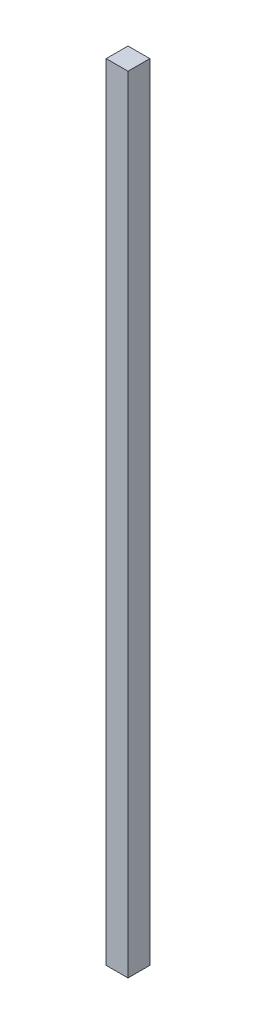
ISO-10303-21;
HEADER;
FILE_DESCRIPTION(('STEP AP214'),'2;1');
FILE_NAME('part.step','',(''),(''),'','','');
FILE_SCHEMA(('AUTOMOTIVE_DESIGN { 1 0 10303 214 1 1 1 1 }'));
ENDSEC;
DATA;
#1=APPLICATION_CONTEXT('core data for automotive mechanical design processes');
#2=APPLICATION_PROTOCOL_DEFINITION('international standard','automotive_design',2000,#1);
#3=PRODUCT_CONTEXT('',#1,'mechanical');
#4=PRODUCT('Part','Part','',(#3));
#5=PRODUCT_RELATED_PRODUCT_CATEGORY('part','',(#4));
#6=PRODUCT_DEFINITION_FORMATION('','',#4);
#7=PRODUCT_DEFINITION_CONTEXT('part definition',#1,'design');
#8=PRODUCT_DEFINITION('design','',#6,#7);
#9=PRODUCT_DEFINITION_SHAPE('','',#8);
#10=(LENGTH_UNIT() NAMED_UNIT(*) SI_UNIT(.MILLI.,.METRE.));
#11=(NAMED_UNIT(*) PLANE_ANGLE_UNIT() SI_UNIT($,.RADIAN.));
#12=(NAMED_UNIT(*) SI_UNIT($,.STERADIAN.) SOLID_ANGLE_UNIT());
#13=UNCERTAINTY_MEASURE_WITH_UNIT(LENGTH_MEASURE(1.E-05),#10,'distance_accuracy_value','');
#14=(GEOMETRIC_REPRESENTATION_CONTEXT(3) GLOBAL_UNCERTAINTY_ASSIGNED_CONTEXT((#13)) GLOBAL_UNIT_ASSIGNED_CONTEXT((#10,
#11,#12)) REPRESENTATION_CONTEXT('',''));
#15=CARTESIAN_POINT('',(0.,0.,0.));
#16=DIRECTION('',(0.,0.,1.));
#17=DIRECTION('',(1.,0.,0.));
#18=AXIS2_PLACEMENT_3D('',#15,#16,#17);
#19=CARTESIAN_POINT('',(25.4,-457.199999999999,12.7));
#20=DIRECTION('',(0.,0.,-1.));
#21=DIRECTION('',(-1.,0.,0.));
#22=AXIS2_PLACEMENT_3D('',#19,#20,#21);
#23=PLANE('',#22);
#24=DIRECTION('',(0.,-1.,0.));
#25=VECTOR('',#24,1.);
#26=CARTESIAN_POINT('',(0.,-457.199999999999,12.7));
#27=LINE('',#26,#25);
#28=CARTESIAN_POINT('',(0.,457.200000000001,12.7));
#29=VERTEX_POINT('',#28);
#30=CARTESIAN_POINT('',(0.,-457.199999999999,12.7));
#31=VERTEX_POINT('',#30);
#32=EDGE_CURVE('E96',#29,#31,#27,.T.);
#33=ORIENTED_EDGE('',*,*,#32,.T.);
#34=DIRECTION('',(-1.,0.,0.));
#35=VECTOR('',#34,1.);
#36=CARTESIAN_POINT('',(25.4,-457.199999999999,12.7));
#37=LINE('',#36,#35);
#38=CARTESIAN_POINT('',(25.4,-457.199999999999,12.7));
#39=VERTEX_POINT('',#38);
#40=EDGE_CURVE('E11',#39,#31,#37,.T.);
#41=ORIENTED_EDGE('',*,*,#40,.F.);
#42=DIRECTION('',(0.,-1.,0.));
#43=VECTOR('',#42,1.);
#44=CARTESIAN_POINT('',(25.4,-457.199999999999,12.7));
#45=LINE('',#44,#43);
#46=CARTESIAN_POINT('',(25.4,457.200000000001,12.7));
#47=VERTEX_POINT('',#46);
#48=EDGE_CURVE('E84',#47,#39,#45,.T.);
#49=ORIENTED_EDGE('',*,*,#48,.F.);
#50=DIRECTION('',(-1.,0.,0.));
#51=VECTOR('',#50,1.);
#52=CARTESIAN_POINT('',(25.4,457.200000000001,12.7));
#53=LINE('',#52,#51);
#54=EDGE_CURVE('E92',#47,#29,#53,.T.);
#55=ORIENTED_EDGE('',*,*,#54,.T.);
#56=EDGE_LOOP('',(#33,#41,#49,#55));
#57=FACE_BOUND('',#56,.T.);
#58=ADVANCED_FACE('F33',(#57),#23,.F.);
#59=CARTESIAN_POINT('',(25.4,-457.199999999999,-12.7));
#60=DIRECTION('',(0.,1.,0.));
#61=DIRECTION('',(0.,0.,1.));
#62=AXIS2_PLACEMENT_3D('',#59,#60,#61);
#63=PLANE('',#62);
#64=DIRECTION('',(0.,0.,-1.));
#65=VECTOR('',#64,1.);
#66=CARTESIAN_POINT('',(0.,-457.199999999999,-12.7));
#67=LINE('',#66,#65);
#68=CARTESIAN_POINT('',(0.,-457.199999999999,-12.7));
#69=VERTEX_POINT('',#68);
#70=EDGE_CURVE('E88',#31,#69,#67,.T.);
#71=ORIENTED_EDGE('',*,*,#70,.T.);
#72=DIRECTION('',(-1.,0.,0.));
#73=VECTOR('',#72,1.);
#74=CARTESIAN_POINT('',(25.4,-457.199999999999,-12.7));
#75=LINE('',#74,#73);
#76=CARTESIAN_POINT('',(25.4,-457.199999999999,-12.7));
#77=VERTEX_POINT('',#76);
#78=EDGE_CURVE('E41',#77,#69,#75,.T.);
#79=ORIENTED_EDGE('',*,*,#78,.F.);
#80=DIRECTION('',(0.,0.,-1.));
#81=VECTOR('',#80,1.);
#82=CARTESIAN_POINT('',(25.4,-457.199999999999,-12.7));
#83=LINE('',#82,#81);
#84=EDGE_CURVE('E79',#39,#77,#83,.T.);
#85=ORIENTED_EDGE('',*,*,#84,.F.);
#86=ORIENTED_EDGE('',*,*,#40,.T.);
#87=EDGE_LOOP('',(#71,#79,#85,#86));
#88=FACE_BOUND('',#87,.T.);
#89=ADVANCED_FACE('F87',(#88),#63,.F.);
#90=CARTESIAN_POINT('',(25.4,-457.199999999999,-12.7));
#91=DIRECTION('',(0.,0.,1.));
#92=DIRECTION('',(1.,0.,0.));
#93=AXIS2_PLACEMENT_3D('',#90,#91,#92);
#94=PLANE('',#93);
#95=DIRECTION('',(0.,1.,0.));
#96=VECTOR('',#95,1.);
#97=CARTESIAN_POINT('',(0.,-457.199999999999,-12.7));
#98=LINE('',#97,#96);
#99=CARTESIAN_POINT('',(0.,457.200000000001,-12.7));
#100=VERTEX_POINT('',#99);
#101=EDGE_CURVE('E66',#69,#100,#98,.T.);
#102=ORIENTED_EDGE('',*,*,#101,.T.);
#103=DIRECTION('',(-1.,0.,0.));
#104=VECTOR('',#103,1.);
#105=CARTESIAN_POINT('',(25.4,457.200000000001,-12.7));
#106=LINE('',#105,#104);
#107=CARTESIAN_POINT('',(25.4,457.200000000001,-12.7));
#108=VERTEX_POINT('',#107);
#109=EDGE_CURVE('E89',#108,#100,#106,.T.);
#110=ORIENTED_EDGE('',*,*,#109,.F.);
#111=DIRECTION('',(0.,1.,0.));
#112=VECTOR('',#111,1.);
#113=CARTESIAN_POINT('',(25.4,-457.199999999999,-12.7));
#114=LINE('',#113,#112);
#115=EDGE_CURVE('E82',#77,#108,#114,.T.);
#116=ORIENTED_EDGE('',*,*,#115,.F.);
#117=ORIENTED_EDGE('',*,*,#78,.T.);
#118=EDGE_LOOP('',(#102,#110,#116,#117));
#119=FACE_BOUND('',#118,.T.);
#120=ADVANCED_FACE('F90',(#119),#94,.F.);
#121=CARTESIAN_POINT('',(25.4,457.200000000001,-12.7));
#122=DIRECTION('',(0.,-1.,0.));
#123=DIRECTION('',(0.,0.,-1.));
#124=AXIS2_PLACEMENT_3D('',#121,#122,#123);
#125=PLANE('',#124);
#126=DIRECTION('',(0.,0.,1.));
#127=VECTOR('',#126,1.);
#128=CARTESIAN_POINT('',(0.,457.200000000001,-12.7));
#129=LINE('',#128,#127);
#130=EDGE_CURVE('E72',#100,#29,#129,.T.);
#131=ORIENTED_EDGE('',*,*,#130,.T.);
#132=ORIENTED_EDGE('',*,*,#54,.F.);
#133=DIRECTION('',(0.,0.,1.));
#134=VECTOR('',#133,1.);
#135=CARTESIAN_POINT('',(25.4,457.200000000001,-12.7));
#136=LINE('',#135,#134);
#137=EDGE_CURVE('E49',#108,#47,#136,.T.);
#138=ORIENTED_EDGE('',*,*,#137,.F.);
#139=ORIENTED_EDGE('',*,*,#109,.T.);
#140=EDGE_LOOP('',(#131,#132,#138,#139));
#141=FACE_BOUND('',#140,.T.);
#142=ADVANCED_FACE('F103',(#141),#125,.F.);
#143=CARTESIAN_POINT('',(25.4,0.,0.));
#144=DIRECTION('',(1.,0.,0.));
#145=DIRECTION('',(0.,0.,-1.));
#146=AXIS2_PLACEMENT_3D('',#143,#144,#145);
#147=PLANE('',#146);
#148=ORIENTED_EDGE('',*,*,#48,.T.);
#149=ORIENTED_EDGE('',*,*,#84,.T.);
#150=ORIENTED_EDGE('',*,*,#115,.T.);
#151=ORIENTED_EDGE('',*,*,#137,.T.);
#152=EDGE_LOOP('',(#148,#149,#150,#151));
#153=FACE_BOUND('',#152,.T.);
#154=ADVANCED_FACE('F80',(#153),#147,.T.);
#155=CARTESIAN_POINT('',(0.,0.,0.));
#156=DIRECTION('',(1.,0.,0.));
#157=DIRECTION('',(0.,0.,-1.));
#158=AXIS2_PLACEMENT_3D('',#155,#156,#157);
#159=PLANE('',#158);
#160=ORIENTED_EDGE('',*,*,#32,.F.);
#161=ORIENTED_EDGE('',*,*,#130,.F.);
#162=ORIENTED_EDGE('',*,*,#101,.F.);
#163=ORIENTED_EDGE('',*,*,#70,.F.);
#164=EDGE_LOOP('',(#160,#161,#162,#163));
#165=FACE_BOUND('',#164,.T.);
#166=ADVANCED_FACE('F106',(#165),#159,.F.);
#167=CLOSED_SHELL('',(#58,#89,#120,#142,#154,#166));
#168=MANIFOLD_SOLID_BREP('B2',#167);
#169=ADVANCED_BREP_SHAPE_REPRESENTATION('',(#18,#168),#14);
#170=SHAPE_DEFINITION_REPRESENTATION(#9,#169);
ENDSEC;
END-ISO-10303-21;
